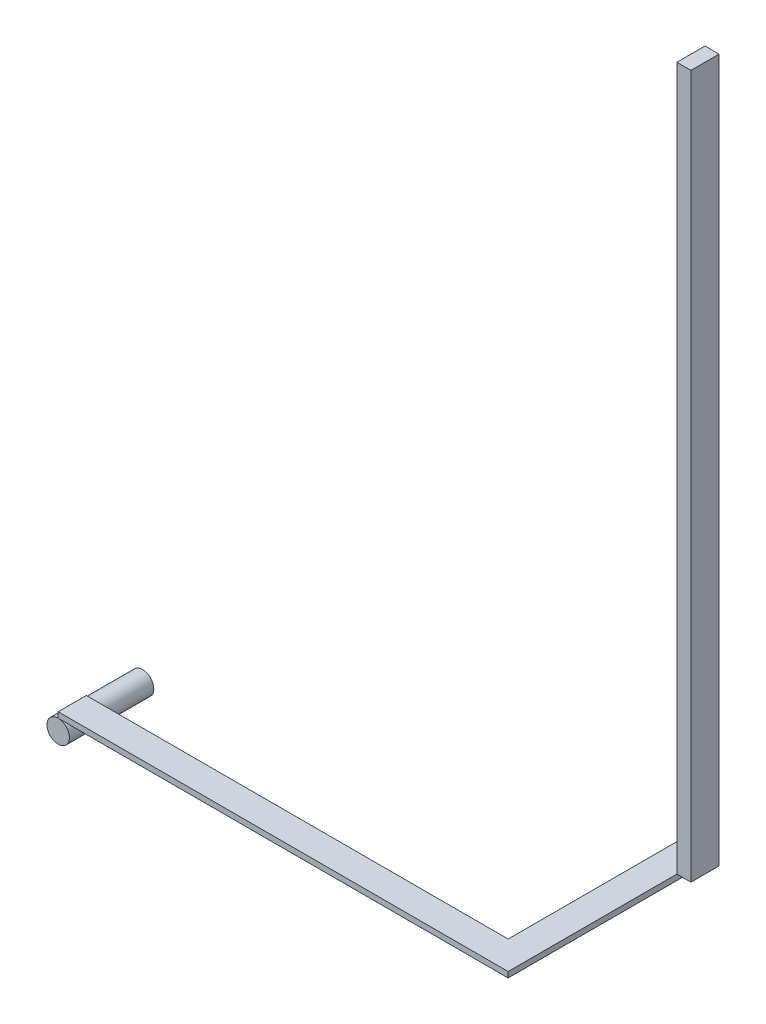
ISO-10303-21;
HEADER;
FILE_DESCRIPTION(('STEP AP214'),'2;1');
FILE_NAME('part.step','',(''),(''),'','','');
FILE_SCHEMA(('AUTOMOTIVE_DESIGN { 1 0 10303 214 1 1 1 1 }'));
ENDSEC;
DATA;
#1=APPLICATION_CONTEXT('core data for automotive mechanical design processes');
#2=APPLICATION_PROTOCOL_DEFINITION('international standard','automotive_design',2000,#1);
#3=PRODUCT_CONTEXT('',#1,'mechanical');
#4=PRODUCT('Part','Part','',(#3));
#5=PRODUCT_RELATED_PRODUCT_CATEGORY('part','',(#4));
#6=PRODUCT_DEFINITION_FORMATION('','',#4);
#7=PRODUCT_DEFINITION_CONTEXT('part definition',#1,'design');
#8=PRODUCT_DEFINITION('design','',#6,#7);
#9=PRODUCT_DEFINITION_SHAPE('','',#8);
#10=(LENGTH_UNIT() NAMED_UNIT(*) SI_UNIT(.MILLI.,.METRE.));
#11=(NAMED_UNIT(*) PLANE_ANGLE_UNIT() SI_UNIT($,.RADIAN.));
#12=(NAMED_UNIT(*) SI_UNIT($,.STERADIAN.) SOLID_ANGLE_UNIT());
#13=UNCERTAINTY_MEASURE_WITH_UNIT(LENGTH_MEASURE(1.E-05),#10,'distance_accuracy_value','');
#14=(GEOMETRIC_REPRESENTATION_CONTEXT(3) GLOBAL_UNCERTAINTY_ASSIGNED_CONTEXT((#13)) GLOBAL_UNIT_ASSIGNED_CONTEXT((#10,
#11,#12)) REPRESENTATION_CONTEXT('',''));
#15=CARTESIAN_POINT('',(0.,0.,0.));
#16=DIRECTION('',(0.,0.,1.));
#17=DIRECTION('',(1.,0.,0.));
#18=AXIS2_PLACEMENT_3D('',#15,#16,#17);
#19=CARTESIAN_POINT('',(165.,6.,-40.));
#20=DIRECTION('',(0.,0.,1.));
#21=DIRECTION('',(0.,-1.,0.));
#22=AXIS2_PLACEMENT_3D('',#19,#20,#21);
#23=PLANE('',#22);
#24=DIRECTION('',(0.,1.,0.));
#25=VECTOR('',#24,1.);
#26=CARTESIAN_POINT('',(160.,6.,-40.));
#27=LINE('',#26,#25);
#28=CARTESIAN_POINT('',(160.,6.,-40.));
#29=VERTEX_POINT('',#28);
#30=CARTESIAN_POINT('',(160.,256.,-40.));
#31=VERTEX_POINT('',#30);
#32=EDGE_CURVE('E107',#29,#31,#27,.T.);
#33=ORIENTED_EDGE('',*,*,#32,.T.);
#34=DIRECTION('',(-1.,0.,0.));
#35=VECTOR('',#34,1.);
#36=CARTESIAN_POINT('',(165.,256.,-40.));
#37=LINE('',#36,#35);
#38=CARTESIAN_POINT('',(165.,256.,-40.));
#39=VERTEX_POINT('',#38);
#40=EDGE_CURVE('E12',#39,#31,#37,.T.);
#41=ORIENTED_EDGE('',*,*,#40,.F.);
#42=DIRECTION('',(0.,1.,0.));
#43=VECTOR('',#42,1.);
#44=CARTESIAN_POINT('',(165.,6.,-40.));
#45=LINE('',#44,#43);
#46=CARTESIAN_POINT('',(165.,6.,-40.));
#47=VERTEX_POINT('',#46);
#48=EDGE_CURVE('E95',#47,#39,#45,.T.);
#49=ORIENTED_EDGE('',*,*,#48,.F.);
#50=DIRECTION('',(-1.,0.,0.));
#51=VECTOR('',#50,1.);
#52=CARTESIAN_POINT('',(165.,6.,-40.));
#53=LINE('',#52,#51);
#54=EDGE_CURVE('E103',#47,#29,#53,.T.);
#55=ORIENTED_EDGE('',*,*,#54,.T.);
#56=EDGE_LOOP('',(#33,#41,#49,#55));
#57=FACE_BOUND('',#56,.T.);
#58=ADVANCED_FACE('F44',(#57),#23,.F.);
#59=CARTESIAN_POINT('',(165.,256.,-40.));
#60=DIRECTION('',(0.,-1.,0.));
#61=DIRECTION('',(0.,0.,-1.));
#62=AXIS2_PLACEMENT_3D('',#59,#60,#61);
#63=PLANE('',#62);
#64=DIRECTION('',(0.,0.,1.));
#65=VECTOR('',#64,1.);
#66=CARTESIAN_POINT('',(160.,256.,-40.));
#67=LINE('',#66,#65);
#68=CARTESIAN_POINT('',(160.,256.,-30.));
#69=VERTEX_POINT('',#68);
#70=EDGE_CURVE('E99',#31,#69,#67,.T.);
#71=ORIENTED_EDGE('',*,*,#70,.T.);
#72=DIRECTION('',(-1.,0.,0.));
#73=VECTOR('',#72,1.);
#74=CARTESIAN_POINT('',(165.,256.,-30.));
#75=LINE('',#74,#73);
#76=CARTESIAN_POINT('',(165.,256.,-30.));
#77=VERTEX_POINT('',#76);
#78=EDGE_CURVE('E52',#77,#69,#75,.T.);
#79=ORIENTED_EDGE('',*,*,#78,.F.);
#80=DIRECTION('',(0.,0.,1.));
#81=VECTOR('',#80,1.);
#82=CARTESIAN_POINT('',(165.,256.,-40.));
#83=LINE('',#82,#81);
#84=EDGE_CURVE('E90',#39,#77,#83,.T.);
#85=ORIENTED_EDGE('',*,*,#84,.F.);
#86=ORIENTED_EDGE('',*,*,#40,.T.);
#87=EDGE_LOOP('',(#71,#79,#85,#86));
#88=FACE_BOUND('',#87,.T.);
#89=ADVANCED_FACE('F98',(#88),#63,.F.);
#90=CARTESIAN_POINT('',(165.,6.,-30.));
#91=DIRECTION('',(0.,0.,-1.));
#92=DIRECTION('',(0.,1.,0.));
#93=AXIS2_PLACEMENT_3D('',#90,#91,#92);
#94=PLANE('',#93);
#95=DIRECTION('',(0.,-1.,0.));
#96=VECTOR('',#95,1.);
#97=CARTESIAN_POINT('',(160.,6.,-30.));
#98=LINE('',#97,#96);
#99=CARTESIAN_POINT('',(160.,6.,-30.));
#100=VERTEX_POINT('',#99);
#101=EDGE_CURVE('E77',#69,#100,#98,.T.);
#102=ORIENTED_EDGE('',*,*,#101,.T.);
#103=DIRECTION('',(-1.,0.,0.));
#104=VECTOR('',#103,1.);
#105=CARTESIAN_POINT('',(165.,6.,-30.));
#106=LINE('',#105,#104);
#107=CARTESIAN_POINT('',(165.,6.,-30.));
#108=VERTEX_POINT('',#107);
#109=EDGE_CURVE('E100',#108,#100,#106,.T.);
#110=ORIENTED_EDGE('',*,*,#109,.F.);
#111=DIRECTION('',(0.,-1.,0.));
#112=VECTOR('',#111,1.);
#113=CARTESIAN_POINT('',(165.,6.,-30.));
#114=LINE('',#113,#112);
#115=EDGE_CURVE('E93',#77,#108,#114,.T.);
#116=ORIENTED_EDGE('',*,*,#115,.F.);
#117=ORIENTED_EDGE('',*,*,#78,.T.);
#118=EDGE_LOOP('',(#102,#110,#116,#117));
#119=FACE_BOUND('',#118,.T.);
#120=ADVANCED_FACE('F101',(#119),#94,.F.);
#121=CARTESIAN_POINT('',(165.,6.,-40.));
#122=DIRECTION('',(0.,1.,0.));
#123=DIRECTION('',(0.,0.,1.));
#124=AXIS2_PLACEMENT_3D('',#121,#122,#123);
#125=PLANE('',#124);
#126=DIRECTION('',(0.,0.,-1.));
#127=VECTOR('',#126,1.);
#128=CARTESIAN_POINT('',(160.,6.,-40.));
#129=LINE('',#128,#127);
#130=EDGE_CURVE('E83',#100,#29,#129,.T.);
#131=ORIENTED_EDGE('',*,*,#130,.T.);
#132=ORIENTED_EDGE('',*,*,#54,.F.);
#133=DIRECTION('',(0.,0.,-1.));
#134=VECTOR('',#133,1.);
#135=CARTESIAN_POINT('',(165.,6.,-40.));
#136=LINE('',#135,#134);
#137=EDGE_CURVE('E60',#108,#47,#136,.T.);
#138=ORIENTED_EDGE('',*,*,#137,.F.);
#139=ORIENTED_EDGE('',*,*,#109,.T.);
#140=EDGE_LOOP('',(#131,#132,#138,#139));
#141=FACE_BOUND('',#140,.T.);
#142=ADVANCED_FACE('F114',(#141),#125,.F.);
#143=CARTESIAN_POINT('',(165.,0.,0.));
#144=DIRECTION('',(1.,0.,0.));
#145=DIRECTION('',(0.,0.,-1.));
#146=AXIS2_PLACEMENT_3D('',#143,#144,#145);
#147=PLANE('',#146);
#148=ORIENTED_EDGE('',*,*,#48,.T.);
#149=ORIENTED_EDGE('',*,*,#84,.T.);
#150=ORIENTED_EDGE('',*,*,#115,.T.);
#151=ORIENTED_EDGE('',*,*,#137,.T.);
#152=EDGE_LOOP('',(#148,#149,#150,#151));
#153=FACE_BOUND('',#152,.T.);
#154=ADVANCED_FACE('F91',(#153),#147,.T.);
#155=CARTESIAN_POINT('',(160.,0.,0.));
#156=DIRECTION('',(1.,0.,0.));
#157=DIRECTION('',(0.,0.,-1.));
#158=AXIS2_PLACEMENT_3D('',#155,#156,#157);
#159=PLANE('',#158);
#160=ORIENTED_EDGE('',*,*,#32,.F.);
#161=ORIENTED_EDGE('',*,*,#130,.F.);
#162=ORIENTED_EDGE('',*,*,#101,.F.);
#163=ORIENTED_EDGE('',*,*,#70,.F.);
#164=EDGE_LOOP('',(#160,#161,#162,#163));
#165=FACE_BOUND('',#164,.T.);
#166=ADVANCED_FACE('F117',(#165),#159,.F.);
#167=CLOSED_SHELL('',(#58,#89,#120,#142,#154,#166));
#168=MANIFOLD_SOLID_BREP('B2',#167);
#169=CARTESIAN_POINT('',(0.,4.,20.));
#170=DIRECTION('',(-1.,0.,0.));
#171=DIRECTION('',(0.,0.,1.));
#172=AXIS2_PLACEMENT_3D('',#169,#170,#171);
#173=PLANE('',#172);
#174=DIRECTION('',(0.,-1.,0.));
#175=VECTOR('',#174,1.);
#176=CARTESIAN_POINT('',(0.,4.,30.));
#177=LINE('',#176,#175);
#178=CARTESIAN_POINT('',(0.,6.,30.));
#179=VERTEX_POINT('',#178);
#180=CARTESIAN_POINT('',(0.,4.,30.));
#181=VERTEX_POINT('',#180);
#182=EDGE_CURVE('E224',#179,#181,#177,.T.);
#183=ORIENTED_EDGE('',*,*,#182,.F.);
#184=DIRECTION('',(0.,0.,1.));
#185=VECTOR('',#184,1.);
#186=CARTESIAN_POINT('',(0.,6.,20.));
#187=LINE('',#186,#185);
#188=CARTESIAN_POINT('',(0.,6.,20.));
#189=VERTEX_POINT('',#188);
#190=EDGE_CURVE('E42',#189,#179,#187,.T.);
#191=ORIENTED_EDGE('',*,*,#190,.F.);
#192=DIRECTION('',(0.,-1.,0.));
#193=VECTOR('',#192,1.);
#194=CARTESIAN_POINT('',(0.,4.,20.));
#195=LINE('',#194,#193);
#196=CARTESIAN_POINT('',(0.,4.,20.));
#197=VERTEX_POINT('',#196);
#198=EDGE_CURVE('E235',#189,#197,#195,.T.);
#199=ORIENTED_EDGE('',*,*,#198,.T.);
#200=DIRECTION('',(0.,0.,1.));
#201=VECTOR('',#200,1.);
#202=CARTESIAN_POINT('',(0.,4.,20.));
#203=LINE('',#202,#201);
#204=EDGE_CURVE('E178',#197,#181,#203,.T.);
#205=ORIENTED_EDGE('',*,*,#204,.T.);
#206=EDGE_LOOP('',(#183,#191,#199,#205));
#207=FACE_BOUND('',#206,.T.);
#208=ADVANCED_FACE('F175',(#207),#173,.T.);
#209=CARTESIAN_POINT('',(0.,6.,20.));
#210=DIRECTION('',(0.,1.,0.));
#211=DIRECTION('',(0.,0.,1.));
#212=AXIS2_PLACEMENT_3D('',#209,#210,#211);
#213=PLANE('',#212);
#214=DIRECTION('',(-1.,0.,0.));
#215=VECTOR('',#214,1.);
#216=CARTESIAN_POINT('',(0.,6.,30.));
#217=LINE('',#216,#215);
#218=CARTESIAN_POINT('',(160.,6.,30.));
#219=VERTEX_POINT('',#218);
#220=EDGE_CURVE('E219',#219,#179,#217,.T.);
#221=ORIENTED_EDGE('',*,*,#220,.F.);
#222=DIRECTION('',(0.,0.,1.));
#223=VECTOR('',#222,1.);
#224=CARTESIAN_POINT('',(160.,6.,20.));
#225=LINE('',#224,#223);
#226=CARTESIAN_POINT('',(160.,6.,-40.));
#227=VERTEX_POINT('',#226);
#228=EDGE_CURVE('E183',#227,#219,#225,.T.);
#229=ORIENTED_EDGE('',*,*,#228,.F.);
#230=DIRECTION('',(1.,0.,0.));
#231=VECTOR('',#230,1.);
#232=CARTESIAN_POINT('',(150.,6.,-40.));
#233=LINE('',#232,#231);
#234=CARTESIAN_POINT('',(150.,6.,-40.));
#235=VERTEX_POINT('',#234);
#236=EDGE_CURVE('E257',#235,#227,#233,.T.);
#237=ORIENTED_EDGE('',*,*,#236,.F.);
#238=DIRECTION('',(0.,0.,1.));
#239=VECTOR('',#238,1.);
#240=CARTESIAN_POINT('',(150.,6.,-40.));
#241=LINE('',#240,#239);
#242=CARTESIAN_POINT('',(150.,6.,20.));
#243=VERTEX_POINT('',#242);
#244=EDGE_CURVE('E229',#235,#243,#241,.T.);
#245=ORIENTED_EDGE('',*,*,#244,.T.);
#246=DIRECTION('',(-1.,0.,0.));
#247=VECTOR('',#246,1.);
#248=CARTESIAN_POINT('',(0.,6.,20.));
#249=LINE('',#248,#247);
#250=EDGE_CURVE('E198',#243,#189,#249,.T.);
#251=ORIENTED_EDGE('',*,*,#250,.T.);
#252=ORIENTED_EDGE('',*,*,#190,.T.);
#253=EDGE_LOOP('',(#221,#229,#237,#245,#251,#252));
#254=FACE_BOUND('',#253,.T.);
#255=ADVANCED_FACE('F216',(#254),#213,.T.);
#256=CARTESIAN_POINT('',(160.,4.,20.));
#257=DIRECTION('',(1.,0.,0.));
#258=DIRECTION('',(0.,0.,-1.));
#259=AXIS2_PLACEMENT_3D('',#256,#257,#258);
#260=PLANE('',#259);
#261=DIRECTION('',(0.,1.,0.));
#262=VECTOR('',#261,1.);
#263=CARTESIAN_POINT('',(160.,4.,30.));
#264=LINE('',#263,#262);
#265=CARTESIAN_POINT('',(160.,4.,30.));
#266=VERTEX_POINT('',#265);
#267=EDGE_CURVE('E234',#266,#219,#264,.T.);
#268=ORIENTED_EDGE('',*,*,#267,.F.);
#269=DIRECTION('',(0.,0.,1.));
#270=VECTOR('',#269,1.);
#271=CARTESIAN_POINT('',(160.,4.,20.));
#272=LINE('',#271,#270);
#273=CARTESIAN_POINT('',(160.,4.,-40.));
#274=VERTEX_POINT('',#273);
#275=EDGE_CURVE('E242',#274,#266,#272,.T.);
#276=ORIENTED_EDGE('',*,*,#275,.F.);
#277=DIRECTION('',(0.,-1.,0.));
#278=VECTOR('',#277,1.);
#279=CARTESIAN_POINT('',(160.,6.,-40.));
#280=LINE('',#279,#278);
#281=EDGE_CURVE('E272',#227,#274,#280,.T.);
#282=ORIENTED_EDGE('',*,*,#281,.F.);
#283=ORIENTED_EDGE('',*,*,#228,.T.);
#284=EDGE_LOOP('',(#268,#276,#282,#283));
#285=FACE_BOUND('',#284,.T.);
#286=ADVANCED_FACE('F282',(#285),#260,.T.);
#287=CARTESIAN_POINT('',(0.,4.,20.));
#288=DIRECTION('',(0.,-1.,0.));
#289=DIRECTION('',(0.,0.,-1.));
#290=AXIS2_PLACEMENT_3D('',#287,#288,#289);
#291=PLANE('',#290);
#292=DIRECTION('',(1.,0.,0.));
#293=VECTOR('',#292,1.);
#294=CARTESIAN_POINT('',(0.,4.,30.));
#295=LINE('',#294,#293);
#296=EDGE_CURVE('E228',#181,#266,#295,.T.);
#297=ORIENTED_EDGE('',*,*,#296,.F.);
#298=ORIENTED_EDGE('',*,*,#204,.F.);
#299=DIRECTION('',(1.,0.,0.));
#300=VECTOR('',#299,1.);
#301=CARTESIAN_POINT('',(0.,4.,20.));
#302=LINE('',#301,#300);
#303=CARTESIAN_POINT('',(150.,4.,20.));
#304=VERTEX_POINT('',#303);
#305=EDGE_CURVE('E237',#197,#304,#302,.T.);
#306=ORIENTED_EDGE('',*,*,#305,.T.);
#307=DIRECTION('',(0.,0.,1.));
#308=VECTOR('',#307,1.);
#309=CARTESIAN_POINT('',(150.,3.99999999999999,-40.));
#310=LINE('',#309,#308);
#311=CARTESIAN_POINT('',(150.,3.99999999999999,-40.));
#312=VERTEX_POINT('',#311);
#313=EDGE_CURVE('E261',#312,#304,#310,.T.);
#314=ORIENTED_EDGE('',*,*,#313,.F.);
#315=DIRECTION('',(-1.,0.,0.));
#316=VECTOR('',#315,1.);
#317=CARTESIAN_POINT('',(150.,3.99999999999999,-40.));
#318=LINE('',#317,#316);
#319=EDGE_CURVE('E269',#274,#312,#318,.T.);
#320=ORIENTED_EDGE('',*,*,#319,.F.);
#321=ORIENTED_EDGE('',*,*,#275,.T.);
#322=EDGE_LOOP('',(#297,#298,#306,#314,#320,#321));
#323=FACE_BOUND('',#322,.T.);
#324=ADVANCED_FACE('F248',(#323),#291,.T.);
#325=CARTESIAN_POINT('',(0.,0.,20.));
#326=DIRECTION('',(0.,0.,-1.));
#327=DIRECTION('',(-1.,0.,0.));
#328=AXIS2_PLACEMENT_3D('',#325,#326,#327);
#329=PLANE('',#328);
#330=DIRECTION('',(0.,1.,0.));
#331=VECTOR('',#330,1.);
#332=CARTESIAN_POINT('',(150.,6.,20.));
#333=LINE('',#332,#331);
#334=EDGE_CURVE('E191',#304,#243,#333,.T.);
#335=ORIENTED_EDGE('',*,*,#334,.F.);
#336=ORIENTED_EDGE('',*,*,#305,.F.);
#337=ORIENTED_EDGE('',*,*,#198,.F.);
#338=ORIENTED_EDGE('',*,*,#250,.F.);
#339=EDGE_LOOP('',(#335,#336,#337,#338));
#340=FACE_BOUND('',#339,.T.);
#341=ADVANCED_FACE('F251',(#340),#329,.T.);
#342=CARTESIAN_POINT('',(0.,0.,30.));
#343=DIRECTION('',(0.,0.,-1.));
#344=DIRECTION('',(-1.,0.,0.));
#345=AXIS2_PLACEMENT_3D('',#342,#343,#344);
#346=PLANE('',#345);
#347=ORIENTED_EDGE('',*,*,#182,.T.);
#348=ORIENTED_EDGE('',*,*,#296,.T.);
#349=ORIENTED_EDGE('',*,*,#267,.T.);
#350=ORIENTED_EDGE('',*,*,#220,.T.);
#351=EDGE_LOOP('',(#347,#348,#349,#350));
#352=FACE_BOUND('',#351,.T.);
#353=ADVANCED_FACE('F232',(#352),#346,.F.);
#354=CARTESIAN_POINT('',(150.,6.,-40.));
#355=DIRECTION('',(1.,0.,0.));
#356=DIRECTION('',(0.,0.,-1.));
#357=AXIS2_PLACEMENT_3D('',#354,#355,#356);
#358=PLANE('',#357);
#359=ORIENTED_EDGE('',*,*,#334,.T.);
#360=ORIENTED_EDGE('',*,*,#244,.F.);
#361=DIRECTION('',(0.,1.,0.));
#362=VECTOR('',#361,1.);
#363=CARTESIAN_POINT('',(150.,6.,-40.));
#364=LINE('',#363,#362);
#365=EDGE_CURVE('E264',#312,#235,#364,.T.);
#366=ORIENTED_EDGE('',*,*,#365,.F.);
#367=ORIENTED_EDGE('',*,*,#313,.T.);
#368=EDGE_LOOP('',(#359,#360,#366,#367));
#369=FACE_BOUND('',#368,.T.);
#370=ADVANCED_FACE('F263',(#369),#358,.F.);
#371=CARTESIAN_POINT('',(0.,0.,-40.));
#372=DIRECTION('',(0.,0.,1.));
#373=DIRECTION('',(1.,0.,0.));
#374=AXIS2_PLACEMENT_3D('',#371,#372,#373);
#375=PLANE('',#374);
#376=ORIENTED_EDGE('',*,*,#365,.T.);
#377=ORIENTED_EDGE('',*,*,#236,.T.);
#378=ORIENTED_EDGE('',*,*,#281,.T.);
#379=ORIENTED_EDGE('',*,*,#319,.T.);
#380=EDGE_LOOP('',(#376,#377,#378,#379));
#381=FACE_BOUND('',#380,.T.);
#382=ADVANCED_FACE('F279',(#381),#375,.F.);
#383=CLOSED_SHELL('',(#208,#255,#286,#324,#341,#353,#370,#382));
#384=MANIFOLD_SOLID_BREP('B6',#383);
#385=CARTESIAN_POINT('',(0.,0.,30.));
#386=DIRECTION('',(0.,0.,-1.));
#387=DIRECTION('',(-1.,0.,0.));
#388=AXIS2_PLACEMENT_3D('',#385,#386,#387);
#389=CYLINDRICAL_SURFACE('',#388,4.);
#390=CARTESIAN_POINT('',(0.,0.,30.));
#391=DIRECTION('',(0.,0.,1.));
#392=DIRECTION('',(1.,0.,0.));
#393=AXIS2_PLACEMENT_3D('',#390,#391,#392);
#394=CIRCLE('',#393,4.);
#395=CARTESIAN_POINT('',(4.,0.,30.));
#396=VERTEX_POINT('',#395);
#397=EDGE_CURVE('E174',#396,#396,#394,.T.);
#398=ORIENTED_EDGE('',*,*,#397,.F.);
#399=EDGE_LOOP('',(#398));
#400=FACE_BOUND('',#399,.T.);
#401=CARTESIAN_POINT('',(0.,0.,0.));
#402=DIRECTION('',(0.,0.,1.));
#403=DIRECTION('',(1.,0.,0.));
#404=AXIS2_PLACEMENT_3D('',#401,#402,#403);
#405=CIRCLE('',#404,4.);
#406=CARTESIAN_POINT('',(4.,0.,0.));
#407=VERTEX_POINT('',#406);
#408=EDGE_CURVE('E363',#407,#407,#405,.T.);
#409=ORIENTED_EDGE('',*,*,#408,.T.);
#410=EDGE_LOOP('',(#409));
#411=FACE_BOUND('',#410,.T.);
#412=ADVANCED_FACE('F360',(#400,#411),#389,.T.);
#413=CARTESIAN_POINT('',(0.,0.,30.));
#414=DIRECTION('',(0.,0.,1.));
#415=DIRECTION('',(1.,0.,0.));
#416=AXIS2_PLACEMENT_3D('',#413,#414,#415);
#417=PLANE('',#416);
#418=ORIENTED_EDGE('',*,*,#397,.T.);
#419=EDGE_LOOP('',(#418));
#420=FACE_BOUND('',#419,.T.);
#421=ADVANCED_FACE('F375',(#420),#417,.T.);
#422=CARTESIAN_POINT('',(0.,0.,0.));
#423=DIRECTION('',(0.,0.,1.));
#424=DIRECTION('',(1.,0.,0.));
#425=AXIS2_PLACEMENT_3D('',#422,#423,#424);
#426=PLANE('',#425);
#427=ORIENTED_EDGE('',*,*,#408,.F.);
#428=EDGE_LOOP('',(#427));
#429=FACE_BOUND('',#428,.T.);
#430=ADVANCED_FACE('F373',(#429),#426,.F.);
#431=CLOSED_SHELL('',(#412,#421,#430));
#432=MANIFOLD_SOLID_BREP('B36',#431);
#433=ADVANCED_BREP_SHAPE_REPRESENTATION('',(#18,#168,#384,#432),#14);
#434=SHAPE_DEFINITION_REPRESENTATION(#9,#433);
ENDSEC;
END-ISO-10303-21;
